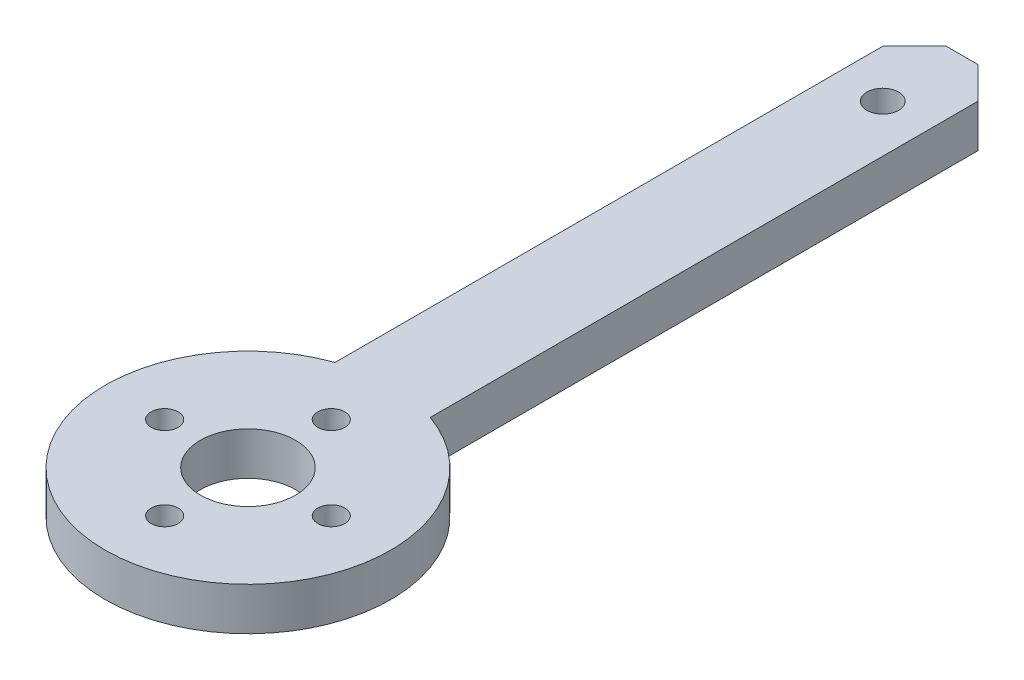
ISO-10303-21;
HEADER;
FILE_DESCRIPTION(('STEP AP214'),'2;1');
FILE_NAME('part.step','',(''),(''),'','','');
FILE_SCHEMA(('AUTOMOTIVE_DESIGN { 1 0 10303 214 1 1 1 1 }'));
ENDSEC;
DATA;
#1=APPLICATION_CONTEXT('core data for automotive mechanical design processes');
#2=APPLICATION_PROTOCOL_DEFINITION('international standard','automotive_design',2000,#1);
#3=PRODUCT_CONTEXT('',#1,'mechanical');
#4=PRODUCT('Part','Part','',(#3));
#5=PRODUCT_RELATED_PRODUCT_CATEGORY('part','',(#4));
#6=PRODUCT_DEFINITION_FORMATION('','',#4);
#7=PRODUCT_DEFINITION_CONTEXT('part definition',#1,'design');
#8=PRODUCT_DEFINITION('design','',#6,#7);
#9=PRODUCT_DEFINITION_SHAPE('','',#8);
#10=(LENGTH_UNIT() NAMED_UNIT(*) SI_UNIT(.MILLI.,.METRE.));
#11=(NAMED_UNIT(*) PLANE_ANGLE_UNIT() SI_UNIT($,.RADIAN.));
#12=(NAMED_UNIT(*) SI_UNIT($,.STERADIAN.) SOLID_ANGLE_UNIT());
#13=UNCERTAINTY_MEASURE_WITH_UNIT(LENGTH_MEASURE(1.E-05),#10,'distance_accuracy_value','');
#14=(GEOMETRIC_REPRESENTATION_CONTEXT(3) GLOBAL_UNCERTAINTY_ASSIGNED_CONTEXT((#13)) GLOBAL_UNIT_ASSIGNED_CONTEXT((#10,
#11,#12)) REPRESENTATION_CONTEXT('',''));
#15=CARTESIAN_POINT('',(0.,0.,0.));
#16=DIRECTION('',(0.,0.,1.));
#17=DIRECTION('',(1.,0.,0.));
#18=AXIS2_PLACEMENT_3D('',#15,#16,#17);
#19=CARTESIAN_POINT('',(0.,5.4,0.));
#20=DIRECTION('',(0.,-1.,0.));
#21=DIRECTION('',(0.,0.,-1.));
#22=AXIS2_PLACEMENT_3D('',#19,#20,#21);
#23=CYLINDRICAL_SURFACE('',#22,18.);
#24=DIRECTION('',(0.,-1.,0.));
#25=VECTOR('',#24,1.);
#26=CARTESIAN_POINT('',(-6.,5.4,-16.9705627484771));
#27=LINE('',#26,#25);
#28=CARTESIAN_POINT('',(-6.,0.,-16.9705627484771));
#29=VERTEX_POINT('',#28);
#30=CARTESIAN_POINT('',(-6.,5.4,-16.9705627484771));
#31=VERTEX_POINT('',#30);
#32=EDGE_CURVE('E101',#29,#31,#27,.F.);
#33=ORIENTED_EDGE('',*,*,#32,.F.);
#34=CARTESIAN_POINT('',(0.,0.,0.));
#35=DIRECTION('',(0.,1.,0.));
#36=DIRECTION('',(0.,0.,1.));
#37=AXIS2_PLACEMENT_3D('',#34,#35,#36);
#38=CIRCLE('',#37,18.);
#39=CARTESIAN_POINT('',(6.,0.,-16.9705627484771));
#40=VERTEX_POINT('',#39);
#41=EDGE_CURVE('E97',#29,#40,#38,.T.);
#42=ORIENTED_EDGE('',*,*,#41,.T.);
#43=DIRECTION('',(0.,-1.,0.));
#44=VECTOR('',#43,1.);
#45=CARTESIAN_POINT('',(6.,5.4,-16.9705627484771));
#46=LINE('',#45,#44);
#47=CARTESIAN_POINT('',(6.,5.4,-16.9705627484771));
#48=VERTEX_POINT('',#47);
#49=EDGE_CURVE('E99',#48,#40,#46,.T.);
#50=ORIENTED_EDGE('',*,*,#49,.F.);
#51=CARTESIAN_POINT('',(0.,5.4,0.));
#52=DIRECTION('',(0.,1.,0.));
#53=DIRECTION('',(0.,0.,1.));
#54=AXIS2_PLACEMENT_3D('',#51,#52,#53);
#55=CIRCLE('',#54,18.);
#56=EDGE_CURVE('E110',#31,#48,#55,.T.);
#57=ORIENTED_EDGE('',*,*,#56,.F.);
#58=EDGE_LOOP('',(#33,#42,#50,#57));
#59=FACE_BOUND('',#58,.T.);
#60=ADVANCED_FACE('F41',(#59),#23,.T.);
#61=CARTESIAN_POINT('',(0.,5.4,0.));
#62=DIRECTION('',(0.,1.,0.));
#63=DIRECTION('',(0.,0.,1.));
#64=AXIS2_PLACEMENT_3D('',#61,#62,#63);
#65=PLANE('',#64);
#66=CARTESIAN_POINT('',(0.,5.4,-80.));
#67=DIRECTION('',(0.,1.,0.));
#68=DIRECTION('',(0.,0.,1.));
#69=AXIS2_PLACEMENT_3D('',#66,#67,#68);
#70=CIRCLE('',#69,2.);
#71=CARTESIAN_POINT('',(0.,5.4,-78.));
#72=VERTEX_POINT('',#71);
#73=EDGE_CURVE('E184',#72,#72,#70,.T.);
#74=ORIENTED_EDGE('',*,*,#73,.F.);
#75=EDGE_LOOP('',(#74));
#76=FACE_BOUND('',#75,.T.);
#77=CARTESIAN_POINT('',(10.5,5.4,0.));
#78=DIRECTION('',(0.,1.,0.));
#79=DIRECTION('',(0.,0.,1.));
#80=AXIS2_PLACEMENT_3D('',#77,#78,#79);
#81=CIRCLE('',#80,1.7);
#82=CARTESIAN_POINT('',(10.5,5.4,-1.7));
#83=VERTEX_POINT('',#82);
#84=EDGE_CURVE('E125',#83,#83,#81,.T.);
#85=ORIENTED_EDGE('',*,*,#84,.F.);
#86=EDGE_LOOP('',(#85));
#87=FACE_BOUND('',#86,.T.);
#88=CARTESIAN_POINT('',(1.09981662173559E-13,5.4,-10.5));
#89=DIRECTION('',(0.,1.,0.));
#90=DIRECTION('',(0.,0.,1.));
#91=AXIS2_PLACEMENT_3D('',#88,#89,#90);
#92=CIRCLE('',#91,1.7);
#93=CARTESIAN_POINT('',(1.09981662173559E-13,5.4,-12.2));
#94=VERTEX_POINT('',#93);
#95=EDGE_CURVE('E169',#94,#94,#92,.T.);
#96=ORIENTED_EDGE('',*,*,#95,.F.);
#97=EDGE_LOOP('',(#96));
#98=FACE_BOUND('',#97,.T.);
#99=CARTESIAN_POINT('',(-10.5,5.4,0.));
#100=DIRECTION('',(0.,1.,0.));
#101=DIRECTION('',(0.,0.,1.));
#102=AXIS2_PLACEMENT_3D('',#99,#100,#101);
#103=CIRCLE('',#102,1.7);
#104=CARTESIAN_POINT('',(-10.5,5.4,-1.70000000000007));
#105=VERTEX_POINT('',#104);
#106=EDGE_CURVE('E176',#105,#105,#103,.T.);
#107=ORIENTED_EDGE('',*,*,#106,.F.);
#108=EDGE_LOOP('',(#107));
#109=FACE_BOUND('',#108,.T.);
#110=CARTESIAN_POINT('',(0.,5.4,10.5));
#111=DIRECTION('',(0.,1.,0.));
#112=DIRECTION('',(0.,0.,1.));
#113=AXIS2_PLACEMENT_3D('',#110,#111,#112);
#114=CIRCLE('',#113,1.7);
#115=CARTESIAN_POINT('',(0.,5.4,8.8));
#116=VERTEX_POINT('',#115);
#117=EDGE_CURVE('E154',#116,#116,#114,.T.);
#118=ORIENTED_EDGE('',*,*,#117,.F.);
#119=EDGE_LOOP('',(#118));
#120=FACE_BOUND('',#119,.T.);
#121=CARTESIAN_POINT('',(0.,5.4,0.));
#122=DIRECTION('',(0.,1.,0.));
#123=DIRECTION('',(0.,0.,1.));
#124=AXIS2_PLACEMENT_3D('',#121,#122,#123);
#125=CIRCLE('',#124,6.);
#126=CARTESIAN_POINT('',(0.,5.4,-6.));
#127=VERTEX_POINT('',#126);
#128=EDGE_CURVE('E162',#127,#127,#125,.T.);
#129=ORIENTED_EDGE('',*,*,#128,.F.);
#130=EDGE_LOOP('',(#129));
#131=FACE_BOUND('',#130,.T.);
#132=DIRECTION('',(-1.,0.,0.));
#133=VECTOR('',#132,1.);
#134=CARTESIAN_POINT('',(-6.,5.4,-90.));
#135=LINE('',#134,#133);
#136=CARTESIAN_POINT('',(2.,5.4,-90.));
#137=VERTEX_POINT('',#136);
#138=CARTESIAN_POINT('',(-1.99999999999998,5.4,-90.));
#139=VERTEX_POINT('',#138);
#140=EDGE_CURVE('E115',#137,#139,#135,.T.);
#141=ORIENTED_EDGE('',*,*,#140,.T.);
#142=DIRECTION('',(0.707106781186549,0.,-0.707106781186546));
#143=VECTOR('',#142,1.);
#144=CARTESIAN_POINT('',(-46.,5.4,-46.0000000000001));
#145=LINE('',#144,#143);
#146=CARTESIAN_POINT('',(-6.,5.4,-86.));
#147=VERTEX_POINT('',#146);
#148=EDGE_CURVE('E49',#139,#147,#145,.F.);
#149=ORIENTED_EDGE('',*,*,#148,.T.);
#150=DIRECTION('',(0.,0.,1.));
#151=VECTOR('',#150,1.);
#152=CARTESIAN_POINT('',(-5.99999999999999,5.4,0.));
#153=LINE('',#152,#151);
#154=EDGE_CURVE('E119',#147,#31,#153,.T.);
#155=ORIENTED_EDGE('',*,*,#154,.T.);
#156=ORIENTED_EDGE('',*,*,#56,.T.);
#157=DIRECTION('',(0.,0.,-1.));
#158=VECTOR('',#157,1.);
#159=CARTESIAN_POINT('',(6.,5.4,0.));
#160=LINE('',#159,#158);
#161=CARTESIAN_POINT('',(6.,5.4,-86.));
#162=VERTEX_POINT('',#161);
#163=EDGE_CURVE('E111',#48,#162,#160,.T.);
#164=ORIENTED_EDGE('',*,*,#163,.T.);
#165=DIRECTION('',(0.707106781186546,0.,0.707106781186549));
#166=VECTOR('',#165,1.);
#167=CARTESIAN_POINT('',(46.,5.4,-45.9999999999998));
#168=LINE('',#167,#166);
#169=EDGE_CURVE('E139',#162,#137,#168,.F.);
#170=ORIENTED_EDGE('',*,*,#169,.T.);
#171=EDGE_LOOP('',(#141,#149,#155,#156,#164,#170));
#172=FACE_BOUND('',#171,.T.);
#173=ADVANCED_FACE('F145',(#76,#87,#98,#109,#120,#131,#172),#65,.T.);
#174=CARTESIAN_POINT('',(0.,0.,0.));
#175=DIRECTION('',(0.,1.,0.));
#176=DIRECTION('',(0.,0.,1.));
#177=AXIS2_PLACEMENT_3D('',#174,#175,#176);
#178=PLANE('',#177);
#179=CARTESIAN_POINT('',(0.,0.,-80.));
#180=DIRECTION('',(0.,1.,0.));
#181=DIRECTION('',(0.,0.,1.));
#182=AXIS2_PLACEMENT_3D('',#179,#180,#181);
#183=CIRCLE('',#182,2.);
#184=CARTESIAN_POINT('',(0.,0.,-78.));
#185=VERTEX_POINT('',#184);
#186=EDGE_CURVE('E173',#185,#185,#183,.T.);
#187=ORIENTED_EDGE('',*,*,#186,.T.);
#188=EDGE_LOOP('',(#187));
#189=FACE_BOUND('',#188,.T.);
#190=CARTESIAN_POINT('',(10.5,0.,0.));
#191=DIRECTION('',(0.,1.,0.));
#192=DIRECTION('',(0.,0.,1.));
#193=AXIS2_PLACEMENT_3D('',#190,#191,#192);
#194=CIRCLE('',#193,1.7);
#195=CARTESIAN_POINT('',(10.5,0.,-1.7));
#196=VERTEX_POINT('',#195);
#197=EDGE_CURVE('E166',#196,#196,#194,.T.);
#198=ORIENTED_EDGE('',*,*,#197,.T.);
#199=EDGE_LOOP('',(#198));
#200=FACE_BOUND('',#199,.T.);
#201=CARTESIAN_POINT('',(1.09981662173559E-13,0.,-10.5));
#202=DIRECTION('',(0.,1.,0.));
#203=DIRECTION('',(0.,0.,1.));
#204=AXIS2_PLACEMENT_3D('',#201,#202,#203);
#205=CIRCLE('',#204,1.7);
#206=CARTESIAN_POINT('',(1.09981662173559E-13,0.,-12.2));
#207=VERTEX_POINT('',#206);
#208=EDGE_CURVE('E175',#207,#207,#205,.T.);
#209=ORIENTED_EDGE('',*,*,#208,.T.);
#210=EDGE_LOOP('',(#209));
#211=FACE_BOUND('',#210,.T.);
#212=CARTESIAN_POINT('',(-10.5,0.,0.));
#213=DIRECTION('',(0.,1.,0.));
#214=DIRECTION('',(0.,0.,1.));
#215=AXIS2_PLACEMENT_3D('',#212,#213,#214);
#216=CIRCLE('',#215,1.7);
#217=CARTESIAN_POINT('',(-10.5,0.,-1.70000000000007));
#218=VERTEX_POINT('',#217);
#219=EDGE_CURVE('E158',#218,#218,#216,.T.);
#220=ORIENTED_EDGE('',*,*,#219,.T.);
#221=EDGE_LOOP('',(#220));
#222=FACE_BOUND('',#221,.T.);
#223=CARTESIAN_POINT('',(0.,0.,10.5));
#224=DIRECTION('',(0.,1.,0.));
#225=DIRECTION('',(0.,0.,1.));
#226=AXIS2_PLACEMENT_3D('',#223,#224,#225);
#227=CIRCLE('',#226,1.7);
#228=CARTESIAN_POINT('',(0.,0.,8.8));
#229=VERTEX_POINT('',#228);
#230=EDGE_CURVE('E159',#229,#229,#227,.T.);
#231=ORIENTED_EDGE('',*,*,#230,.T.);
#232=EDGE_LOOP('',(#231));
#233=FACE_BOUND('',#232,.T.);
#234=CARTESIAN_POINT('',(0.,0.,0.));
#235=DIRECTION('',(0.,1.,0.));
#236=DIRECTION('',(0.,0.,1.));
#237=AXIS2_PLACEMENT_3D('',#234,#235,#236);
#238=CIRCLE('',#237,6.);
#239=CARTESIAN_POINT('',(0.,0.,-6.));
#240=VERTEX_POINT('',#239);
#241=EDGE_CURVE('E164',#240,#240,#238,.T.);
#242=ORIENTED_EDGE('',*,*,#241,.T.);
#243=EDGE_LOOP('',(#242));
#244=FACE_BOUND('',#243,.T.);
#245=DIRECTION('',(0.,0.,1.));
#246=VECTOR('',#245,1.);
#247=CARTESIAN_POINT('',(-5.99999999999999,0.,0.));
#248=LINE('',#247,#246);
#249=CARTESIAN_POINT('',(-6.,0.,-86.));
#250=VERTEX_POINT('',#249);
#251=EDGE_CURVE('E117',#250,#29,#248,.T.);
#252=ORIENTED_EDGE('',*,*,#251,.F.);
#253=DIRECTION('',(-0.707106781186549,0.,0.707106781186546));
#254=VECTOR('',#253,1.);
#255=CARTESIAN_POINT('',(-6.,0.,-86.));
#256=LINE('',#255,#254);
#257=CARTESIAN_POINT('',(-1.99999999999998,0.,-90.));
#258=VERTEX_POINT('',#257);
#259=EDGE_CURVE('E135',#250,#258,#256,.F.);
#260=ORIENTED_EDGE('',*,*,#259,.T.);
#261=DIRECTION('',(-1.,0.,0.));
#262=VECTOR('',#261,1.);
#263=CARTESIAN_POINT('',(-6.,0.,-90.));
#264=LINE('',#263,#262);
#265=CARTESIAN_POINT('',(2.,0.,-90.));
#266=VERTEX_POINT('',#265);
#267=EDGE_CURVE('E120',#266,#258,#264,.T.);
#268=ORIENTED_EDGE('',*,*,#267,.F.);
#269=DIRECTION('',(-0.707106781186546,0.,-0.707106781186549));
#270=VECTOR('',#269,1.);
#271=CARTESIAN_POINT('',(2.,0.,-90.));
#272=LINE('',#271,#270);
#273=CARTESIAN_POINT('',(6.,0.,-86.));
#274=VERTEX_POINT('',#273);
#275=EDGE_CURVE('E116',#266,#274,#272,.F.);
#276=ORIENTED_EDGE('',*,*,#275,.T.);
#277=DIRECTION('',(0.,0.,-1.));
#278=VECTOR('',#277,1.);
#279=CARTESIAN_POINT('',(6.,0.,0.));
#280=LINE('',#279,#278);
#281=EDGE_CURVE('E109',#40,#274,#280,.T.);
#282=ORIENTED_EDGE('',*,*,#281,.F.);
#283=ORIENTED_EDGE('',*,*,#41,.F.);
#284=EDGE_LOOP('',(#252,#260,#268,#276,#282,#283));
#285=FACE_BOUND('',#284,.T.);
#286=ADVANCED_FACE('F112',(#189,#200,#211,#222,#233,#244,#285),#178,.F.);
#287=CARTESIAN_POINT('',(-5.99999999999999,5.4,0.));
#288=DIRECTION('',(1.,0.,0.));
#289=DIRECTION('',(0.,0.,-1.));
#290=AXIS2_PLACEMENT_3D('',#287,#288,#289);
#291=PLANE('',#290);
#292=ORIENTED_EDGE('',*,*,#154,.F.);
#293=DIRECTION('',(0.,-1.,0.));
#294=VECTOR('',#293,1.);
#295=CARTESIAN_POINT('',(-6.,5.4,-86.));
#296=LINE('',#295,#294);
#297=EDGE_CURVE('E130',#147,#250,#296,.T.);
#298=ORIENTED_EDGE('',*,*,#297,.T.);
#299=ORIENTED_EDGE('',*,*,#251,.T.);
#300=ORIENTED_EDGE('',*,*,#32,.T.);
#301=EDGE_LOOP('',(#292,#298,#299,#300));
#302=FACE_BOUND('',#301,.T.);
#303=ADVANCED_FACE('F147',(#302),#291,.F.);
#304=CARTESIAN_POINT('',(6.,5.4,0.));
#305=DIRECTION('',(-1.,0.,0.));
#306=DIRECTION('',(0.,0.,1.));
#307=AXIS2_PLACEMENT_3D('',#304,#305,#306);
#308=PLANE('',#307);
#309=ORIENTED_EDGE('',*,*,#281,.T.);
#310=DIRECTION('',(0.,1.,0.));
#311=VECTOR('',#310,1.);
#312=CARTESIAN_POINT('',(6.,5.4,-86.));
#313=LINE('',#312,#311);
#314=EDGE_CURVE('E11',#274,#162,#313,.T.);
#315=ORIENTED_EDGE('',*,*,#314,.T.);
#316=ORIENTED_EDGE('',*,*,#163,.F.);
#317=ORIENTED_EDGE('',*,*,#49,.T.);
#318=EDGE_LOOP('',(#309,#315,#316,#317));
#319=FACE_BOUND('',#318,.T.);
#320=ADVANCED_FACE('F107',(#319),#308,.F.);
#321=CARTESIAN_POINT('',(-6.,5.4,-90.));
#322=DIRECTION('',(0.,0.,1.));
#323=DIRECTION('',(1.,0.,0.));
#324=AXIS2_PLACEMENT_3D('',#321,#322,#323);
#325=PLANE('',#324);
#326=ORIENTED_EDGE('',*,*,#267,.T.);
#327=DIRECTION('',(0.,1.,0.));
#328=VECTOR('',#327,1.);
#329=CARTESIAN_POINT('',(-1.99999999999998,5.4,-90.));
#330=LINE('',#329,#328);
#331=EDGE_CURVE('E64',#258,#139,#330,.T.);
#332=ORIENTED_EDGE('',*,*,#331,.T.);
#333=ORIENTED_EDGE('',*,*,#140,.F.);
#334=DIRECTION('',(0.,-1.,0.));
#335=VECTOR('',#334,1.);
#336=CARTESIAN_POINT('',(2.,5.4,-90.));
#337=LINE('',#336,#335);
#338=EDGE_CURVE('E133',#137,#266,#337,.T.);
#339=ORIENTED_EDGE('',*,*,#338,.T.);
#340=EDGE_LOOP('',(#326,#332,#333,#339));
#341=FACE_BOUND('',#340,.T.);
#342=ADVANCED_FACE('F146',(#341),#325,.F.);
#343=CARTESIAN_POINT('',(0.,5.4,0.));
#344=DIRECTION('',(0.,-1.,0.));
#345=DIRECTION('',(0.,0.,-1.));
#346=AXIS2_PLACEMENT_3D('',#343,#344,#345);
#347=CYLINDRICAL_SURFACE('',#346,6.);
#348=CARTESIAN_POINT('',(0.,5.4,-6.));
#349=CARTESIAN_POINT('',(0.,5.34375,-6.));
#350=CARTESIAN_POINT('',(0.,5.2875,-6.));
#351=CARTESIAN_POINT('',(0.,5.175,-6.));
#352=CARTESIAN_POINT('',(0.,5.11875,-6.));
#353=CARTESIAN_POINT('',(0.,5.00625,-6.));
#354=CARTESIAN_POINT('',(0.,4.95,-6.));
#355=CARTESIAN_POINT('',(0.,4.8375,-6.));
#356=CARTESIAN_POINT('',(0.,4.78125,-6.));
#357=CARTESIAN_POINT('',(0.,4.66875,-6.));
#358=CARTESIAN_POINT('',(0.,4.6125,-6.));
#359=CARTESIAN_POINT('',(0.,4.5,-6.));
#360=CARTESIAN_POINT('',(0.,4.44375,-6.));
#361=CARTESIAN_POINT('',(0.,4.33125,-6.));
#362=CARTESIAN_POINT('',(0.,4.275,-6.));
#363=CARTESIAN_POINT('',(0.,4.1625,-6.));
#364=CARTESIAN_POINT('',(0.,4.10625,-6.));
#365=CARTESIAN_POINT('',(0.,3.99375,-6.));
#366=CARTESIAN_POINT('',(0.,3.9375,-6.));
#367=CARTESIAN_POINT('',(0.,3.825,-6.));
#368=CARTESIAN_POINT('',(0.,3.76875,-6.));
#369=CARTESIAN_POINT('',(0.,3.65625,-6.));
#370=CARTESIAN_POINT('',(0.,3.6,-6.));
#371=CARTESIAN_POINT('',(0.,3.4875,-6.));
#372=CARTESIAN_POINT('',(0.,3.43125,-6.));
#373=CARTESIAN_POINT('',(0.,3.31875,-6.));
#374=CARTESIAN_POINT('',(0.,3.2625,-6.));
#375=CARTESIAN_POINT('',(0.,3.15,-6.));
#376=CARTESIAN_POINT('',(0.,3.09375,-6.));
#377=CARTESIAN_POINT('',(0.,2.98125,-6.));
#378=CARTESIAN_POINT('',(0.,2.925,-6.));
#379=CARTESIAN_POINT('',(0.,2.8125,-6.));
#380=CARTESIAN_POINT('',(0.,2.75625,-6.));
#381=CARTESIAN_POINT('',(0.,2.64375,-6.));
#382=CARTESIAN_POINT('',(0.,2.5875,-6.));
#383=CARTESIAN_POINT('',(0.,2.475,-6.));
#384=CARTESIAN_POINT('',(0.,2.41875,-6.));
#385=CARTESIAN_POINT('',(0.,2.30625,-6.));
#386=CARTESIAN_POINT('',(0.,2.25,-6.));
#387=CARTESIAN_POINT('',(0.,2.1375,-6.));
#388=CARTESIAN_POINT('',(0.,2.08125,-6.));
#389=CARTESIAN_POINT('',(0.,1.96875,-6.));
#390=CARTESIAN_POINT('',(0.,1.9125,-6.));
#391=CARTESIAN_POINT('',(0.,1.8,-6.));
#392=CARTESIAN_POINT('',(0.,1.74375,-6.));
#393=CARTESIAN_POINT('',(0.,1.63125,-6.));
#394=CARTESIAN_POINT('',(0.,1.575,-6.));
#395=CARTESIAN_POINT('',(0.,1.4625,-6.));
#396=CARTESIAN_POINT('',(0.,1.40625,-6.));
#397=CARTESIAN_POINT('',(0.,1.29375,-6.));
#398=CARTESIAN_POINT('',(0.,1.2375,-6.));
#399=CARTESIAN_POINT('',(0.,1.125,-6.));
#400=CARTESIAN_POINT('',(0.,1.06875,-6.));
#401=CARTESIAN_POINT('',(0.,0.956249999999999,-6.));
#402=CARTESIAN_POINT('',(0.,0.899999999999999,-6.));
#403=CARTESIAN_POINT('',(0.,0.787499999999999,-6.));
#404=CARTESIAN_POINT('',(0.,0.731249999999999,-6.));
#405=CARTESIAN_POINT('',(0.,0.618749999999999,-6.));
#406=CARTESIAN_POINT('',(0.,0.562499999999999,-6.));
#407=CARTESIAN_POINT('',(0.,0.449999999999999,-6.));
#408=CARTESIAN_POINT('',(0.,0.393749999999999,-6.));
#409=CARTESIAN_POINT('',(0.,0.281249999999999,-6.));
#410=CARTESIAN_POINT('',(0.,0.224999999999999,-6.));
#411=CARTESIAN_POINT('',(0.,0.112499999999999,-6.));
#412=CARTESIAN_POINT('',(0.,0.0562499999999989,-6.));
#413=CARTESIAN_POINT('',(0.,0.,-6.));
#414=B_SPLINE_CURVE_WITH_KNOTS('',3,(#348,#349,#350,#351,#352,#353,#354,#355,#356,#357,#358,
#359,#360,#361,#362,#363,#364,#365,#366,#367,#368,#369,#370,#371,#372,#373,#374,#375,#376,#377,
#378,#379,#380,#381,#382,#383,#384,#385,#386,#387,#388,#389,#390,#391,#392,#393,#394,#395,#396,
#397,#398,#399,#400,#401,#402,#403,#404,#405,#406,#407,#408,#409,#410,#411,#412,#413),
.UNSPECIFIED.,.F.,.F.,(4,2,2,2,2,2,2,2,2,2,2,2,2,2,2,2,2,2,2,2,2,2,2,2,2,2,2,2,2,2,2,2,4),(0.,
0.16875,0.337499999999999,0.50625,0.674999999999999,0.84375,1.0125,1.18125,1.35,1.51875,1.6875,
1.85625,2.025,2.19375,2.3625,2.53125,2.7,2.86875,3.0375,3.20625,3.375,3.54375,3.7125,3.88125,
4.05,4.21875,4.3875,4.55625,4.725,4.89375,5.0625,5.23125,5.4),.UNSPECIFIED.);
#415=EDGE_CURVE('BSEAM215',#127,#240,#414,.T.);
#416=ORIENTED_EDGE('',*,*,#128,.T.);
#417=ORIENTED_EDGE('',*,*,#241,.F.);
#418=ORIENTED_EDGE('',*,*,#415,.T.);
#419=ORIENTED_EDGE('',*,*,#415,.F.);
#420=EDGE_LOOP('',(#416,#418,#417,#419));
#421=FACE_BOUND('',#420,.T.);
#422=ADVANCED_FACE('F215',(#421),#347,.F.);
#423=CARTESIAN_POINT('',(0.,5.4,10.5));
#424=DIRECTION('',(0.,-1.,0.));
#425=DIRECTION('',(0.,0.,-1.));
#426=AXIS2_PLACEMENT_3D('',#423,#424,#425);
#427=CYLINDRICAL_SURFACE('',#426,1.7);
#428=CARTESIAN_POINT('',(0.,5.4,8.8));
#429=CARTESIAN_POINT('',(0.,5.34375,8.8));
#430=CARTESIAN_POINT('',(0.,5.2875,8.8));
#431=CARTESIAN_POINT('',(0.,5.175,8.8));
#432=CARTESIAN_POINT('',(0.,5.11875,8.8));
#433=CARTESIAN_POINT('',(0.,5.00625,8.8));
#434=CARTESIAN_POINT('',(0.,4.95,8.8));
#435=CARTESIAN_POINT('',(0.,4.8375,8.8));
#436=CARTESIAN_POINT('',(0.,4.78125,8.8));
#437=CARTESIAN_POINT('',(0.,4.66875,8.8));
#438=CARTESIAN_POINT('',(0.,4.6125,8.8));
#439=CARTESIAN_POINT('',(0.,4.5,8.8));
#440=CARTESIAN_POINT('',(0.,4.44375,8.8));
#441=CARTESIAN_POINT('',(0.,4.33125,8.8));
#442=CARTESIAN_POINT('',(0.,4.275,8.8));
#443=CARTESIAN_POINT('',(0.,4.1625,8.8));
#444=CARTESIAN_POINT('',(0.,4.10625,8.8));
#445=CARTESIAN_POINT('',(0.,3.99375,8.8));
#446=CARTESIAN_POINT('',(0.,3.9375,8.8));
#447=CARTESIAN_POINT('',(0.,3.825,8.8));
#448=CARTESIAN_POINT('',(0.,3.76875,8.8));
#449=CARTESIAN_POINT('',(0.,3.65625,8.8));
#450=CARTESIAN_POINT('',(0.,3.6,8.8));
#451=CARTESIAN_POINT('',(0.,3.4875,8.8));
#452=CARTESIAN_POINT('',(0.,3.43125,8.8));
#453=CARTESIAN_POINT('',(0.,3.31875,8.8));
#454=CARTESIAN_POINT('',(0.,3.2625,8.8));
#455=CARTESIAN_POINT('',(0.,3.15,8.8));
#456=CARTESIAN_POINT('',(0.,3.09375,8.8));
#457=CARTESIAN_POINT('',(0.,2.98125,8.8));
#458=CARTESIAN_POINT('',(0.,2.925,8.8));
#459=CARTESIAN_POINT('',(0.,2.8125,8.8));
#460=CARTESIAN_POINT('',(0.,2.75625,8.8));
#461=CARTESIAN_POINT('',(0.,2.64375,8.8));
#462=CARTESIAN_POINT('',(0.,2.5875,8.8));
#463=CARTESIAN_POINT('',(0.,2.475,8.8));
#464=CARTESIAN_POINT('',(0.,2.41875,8.8));
#465=CARTESIAN_POINT('',(0.,2.30625,8.8));
#466=CARTESIAN_POINT('',(0.,2.25,8.8));
#467=CARTESIAN_POINT('',(0.,2.1375,8.8));
#468=CARTESIAN_POINT('',(0.,2.08125,8.8));
#469=CARTESIAN_POINT('',(0.,1.96875,8.8));
#470=CARTESIAN_POINT('',(0.,1.9125,8.8));
#471=CARTESIAN_POINT('',(0.,1.8,8.8));
#472=CARTESIAN_POINT('',(0.,1.74375,8.8));
#473=CARTESIAN_POINT('',(0.,1.63125,8.8));
#474=CARTESIAN_POINT('',(0.,1.575,8.8));
#475=CARTESIAN_POINT('',(0.,1.4625,8.8));
#476=CARTESIAN_POINT('',(0.,1.40625,8.8));
#477=CARTESIAN_POINT('',(0.,1.29375,8.8));
#478=CARTESIAN_POINT('',(0.,1.2375,8.8));
#479=CARTESIAN_POINT('',(0.,1.125,8.8));
#480=CARTESIAN_POINT('',(0.,1.06875,8.8));
#481=CARTESIAN_POINT('',(0.,0.95625,8.8));
#482=CARTESIAN_POINT('',(0.,0.9,8.8));
#483=CARTESIAN_POINT('',(0.,0.7875,8.8));
#484=CARTESIAN_POINT('',(0.,0.73125,8.8));
#485=CARTESIAN_POINT('',(0.,0.618749999999999,8.8));
#486=CARTESIAN_POINT('',(0.,0.562499999999999,8.8));
#487=CARTESIAN_POINT('',(0.,0.449999999999999,8.8));
#488=CARTESIAN_POINT('',(0.,0.393749999999999,8.8));
#489=CARTESIAN_POINT('',(0.,0.281249999999999,8.8));
#490=CARTESIAN_POINT('',(0.,0.225,8.8));
#491=CARTESIAN_POINT('',(0.,0.112499999999999,8.8));
#492=CARTESIAN_POINT('',(0.,0.0562499999999992,8.8));
#493=CARTESIAN_POINT('',(0.,0.,8.8));
#494=B_SPLINE_CURVE_WITH_KNOTS('',3,(#428,#429,#430,#431,#432,#433,#434,#435,#436,#437,#438,
#439,#440,#441,#442,#443,#444,#445,#446,#447,#448,#449,#450,#451,#452,#453,#454,#455,#456,#457,
#458,#459,#460,#461,#462,#463,#464,#465,#466,#467,#468,#469,#470,#471,#472,#473,#474,#475,#476,
#477,#478,#479,#480,#481,#482,#483,#484,#485,#486,#487,#488,#489,#490,#491,#492,#493),
.UNSPECIFIED.,.F.,.F.,(4,2,2,2,2,2,2,2,2,2,2,2,2,2,2,2,2,2,2,2,2,2,2,2,2,2,2,2,2,2,2,2,4),(0.,
0.168750000000001,0.3375,0.506250000000001,0.675,0.843750000000001,1.0125,1.18125,1.35,1.51875,
1.6875,1.85625,2.025,2.19375,2.3625,2.53125,2.7,2.86875,3.0375,3.20625,3.375,3.54375,3.7125,
3.88125,4.05,4.21875,4.3875,4.55625,4.725,4.89375,5.0625,5.23125,5.4),.UNSPECIFIED.);
#495=EDGE_CURVE('BSEAM213',#116,#229,#494,.T.);
#496=ORIENTED_EDGE('',*,*,#117,.T.);
#497=ORIENTED_EDGE('',*,*,#230,.F.);
#498=ORIENTED_EDGE('',*,*,#495,.T.);
#499=ORIENTED_EDGE('',*,*,#495,.F.);
#500=EDGE_LOOP('',(#496,#498,#497,#499));
#501=FACE_BOUND('',#500,.T.);
#502=ADVANCED_FACE('F213',(#501),#427,.F.);
#503=CARTESIAN_POINT('',(-10.5,5.4,0.));
#504=DIRECTION('',(0.,-1.,0.));
#505=DIRECTION('',(0.,0.,-1.));
#506=AXIS2_PLACEMENT_3D('',#503,#504,#505);
#507=CYLINDRICAL_SURFACE('',#506,1.7);
#508=CARTESIAN_POINT('',(-10.5,5.4,-1.70000000000007));
#509=CARTESIAN_POINT('',(-10.5,5.34375,-1.70000000000007));
#510=CARTESIAN_POINT('',(-10.5,5.2875,-1.70000000000007));
#511=CARTESIAN_POINT('',(-10.5,5.175,-1.70000000000007));
#512=CARTESIAN_POINT('',(-10.5,5.11875,-1.70000000000007));
#513=CARTESIAN_POINT('',(-10.5,5.00625,-1.70000000000007));
#514=CARTESIAN_POINT('',(-10.5,4.95,-1.70000000000007));
#515=CARTESIAN_POINT('',(-10.5,4.8375,-1.70000000000007));
#516=CARTESIAN_POINT('',(-10.5,4.78125,-1.70000000000007));
#517=CARTESIAN_POINT('',(-10.5,4.66875,-1.70000000000007));
#518=CARTESIAN_POINT('',(-10.5,4.6125,-1.70000000000007));
#519=CARTESIAN_POINT('',(-10.5,4.5,-1.70000000000007));
#520=CARTESIAN_POINT('',(-10.5,4.44375,-1.70000000000007));
#521=CARTESIAN_POINT('',(-10.5,4.33125,-1.70000000000007));
#522=CARTESIAN_POINT('',(-10.5,4.275,-1.70000000000007));
#523=CARTESIAN_POINT('',(-10.5,4.1625,-1.70000000000007));
#524=CARTESIAN_POINT('',(-10.5,4.10625,-1.70000000000007));
#525=CARTESIAN_POINT('',(-10.5,3.99375,-1.70000000000007));
#526=CARTESIAN_POINT('',(-10.5,3.9375,-1.70000000000007));
#527=CARTESIAN_POINT('',(-10.5,3.825,-1.70000000000007));
#528=CARTESIAN_POINT('',(-10.5,3.76875,-1.70000000000007));
#529=CARTESIAN_POINT('',(-10.5,3.65625,-1.70000000000007));
#530=CARTESIAN_POINT('',(-10.5,3.6,-1.70000000000007));
#531=CARTESIAN_POINT('',(-10.5,3.4875,-1.70000000000007));
#532=CARTESIAN_POINT('',(-10.5,3.43125,-1.70000000000007));
#533=CARTESIAN_POINT('',(-10.5,3.31875,-1.70000000000007));
#534=CARTESIAN_POINT('',(-10.5,3.2625,-1.70000000000007));
#535=CARTESIAN_POINT('',(-10.5,3.15,-1.70000000000007));
#536=CARTESIAN_POINT('',(-10.5,3.09375,-1.70000000000007));
#537=CARTESIAN_POINT('',(-10.5,2.98125,-1.70000000000007));
#538=CARTESIAN_POINT('',(-10.5,2.925,-1.70000000000007));
#539=CARTESIAN_POINT('',(-10.5,2.8125,-1.70000000000007));
#540=CARTESIAN_POINT('',(-10.5,2.75625,-1.70000000000007));
#541=CARTESIAN_POINT('',(-10.5,2.64375,-1.70000000000007));
#542=CARTESIAN_POINT('',(-10.5,2.5875,-1.70000000000007));
#543=CARTESIAN_POINT('',(-10.5,2.475,-1.70000000000007));
#544=CARTESIAN_POINT('',(-10.5,2.41875,-1.70000000000007));
#545=CARTESIAN_POINT('',(-10.5,2.30625,-1.70000000000007));
#546=CARTESIAN_POINT('',(-10.5,2.25,-1.70000000000007));
#547=CARTESIAN_POINT('',(-10.5,2.1375,-1.70000000000007));
#548=CARTESIAN_POINT('',(-10.5,2.08125,-1.70000000000007));
#549=CARTESIAN_POINT('',(-10.5,1.96875,-1.70000000000007));
#550=CARTESIAN_POINT('',(-10.5,1.9125,-1.70000000000007));
#551=CARTESIAN_POINT('',(-10.5,1.8,-1.70000000000007));
#552=CARTESIAN_POINT('',(-10.5,1.74375,-1.70000000000007));
#553=CARTESIAN_POINT('',(-10.5,1.63125,-1.70000000000007));
#554=CARTESIAN_POINT('',(-10.5,1.575,-1.70000000000007));
#555=CARTESIAN_POINT('',(-10.5,1.4625,-1.70000000000007));
#556=CARTESIAN_POINT('',(-10.5,1.40625,-1.70000000000007));
#557=CARTESIAN_POINT('',(-10.5,1.29375,-1.70000000000007));
#558=CARTESIAN_POINT('',(-10.5,1.2375,-1.70000000000007));
#559=CARTESIAN_POINT('',(-10.5,1.125,-1.70000000000007));
#560=CARTESIAN_POINT('',(-10.5,1.06875,-1.70000000000007));
#561=CARTESIAN_POINT('',(-10.5,0.95625,-1.70000000000007));
#562=CARTESIAN_POINT('',(-10.5,0.9,-1.70000000000007));
#563=CARTESIAN_POINT('',(-10.5,0.7875,-1.70000000000007));
#564=CARTESIAN_POINT('',(-10.5,0.73125,-1.70000000000007));
#565=CARTESIAN_POINT('',(-10.5,0.618749999999999,-1.70000000000007));
#566=CARTESIAN_POINT('',(-10.5,0.562499999999999,-1.70000000000007));
#567=CARTESIAN_POINT('',(-10.5,0.449999999999999,-1.70000000000007));
#568=CARTESIAN_POINT('',(-10.5,0.393749999999999,-1.70000000000007));
#569=CARTESIAN_POINT('',(-10.5,0.281249999999999,-1.70000000000007));
#570=CARTESIAN_POINT('',(-10.5,0.225,-1.70000000000007));
#571=CARTESIAN_POINT('',(-10.5,0.112499999999999,-1.70000000000007));
#572=CARTESIAN_POINT('',(-10.5,0.0562499999999992,-1.70000000000007));
#573=CARTESIAN_POINT('',(-10.5,0.,-1.70000000000007));
#574=B_SPLINE_CURVE_WITH_KNOTS('',3,(#508,#509,#510,#511,#512,#513,#514,#515,#516,#517,#518,
#519,#520,#521,#522,#523,#524,#525,#526,#527,#528,#529,#530,#531,#532,#533,#534,#535,#536,#537,
#538,#539,#540,#541,#542,#543,#544,#545,#546,#547,#548,#549,#550,#551,#552,#553,#554,#555,#556,
#557,#558,#559,#560,#561,#562,#563,#564,#565,#566,#567,#568,#569,#570,#571,#572,#573),
.UNSPECIFIED.,.F.,.F.,(4,2,2,2,2,2,2,2,2,2,2,2,2,2,2,2,2,2,2,2,2,2,2,2,2,2,2,2,2,2,2,2,4),(0.,
0.168750000000001,0.3375,0.506250000000001,0.675,0.843750000000001,1.0125,1.18125,1.35,1.51875,
1.6875,1.85625,2.025,2.19375,2.3625,2.53125,2.7,2.86875,3.0375,3.20625,3.375,3.54375,3.7125,
3.88125,4.05,4.21875,4.3875,4.55625,4.725,4.89375,5.0625,5.23125,5.4),.UNSPECIFIED.);
#575=EDGE_CURVE('BSEAM244',#105,#218,#574,.T.);
#576=ORIENTED_EDGE('',*,*,#106,.T.);
#577=ORIENTED_EDGE('',*,*,#219,.F.);
#578=ORIENTED_EDGE('',*,*,#575,.T.);
#579=ORIENTED_EDGE('',*,*,#575,.F.);
#580=EDGE_LOOP('',(#576,#578,#577,#579));
#581=FACE_BOUND('',#580,.T.);
#582=ADVANCED_FACE('F244',(#581),#507,.F.);
#583=CARTESIAN_POINT('',(1.09981662173559E-13,5.4,-10.5));
#584=DIRECTION('',(0.,-1.,0.));
#585=DIRECTION('',(0.,0.,-1.));
#586=AXIS2_PLACEMENT_3D('',#583,#584,#585);
#587=CYLINDRICAL_SURFACE('',#586,1.7);
#588=CARTESIAN_POINT('',(1.09981662173559E-13,5.4,-12.2));
#589=CARTESIAN_POINT('',(1.09981662173559E-13,5.34375,-12.2));
#590=CARTESIAN_POINT('',(1.09981662173559E-13,5.2875,-12.2));
#591=CARTESIAN_POINT('',(1.09981662173559E-13,5.175,-12.2));
#592=CARTESIAN_POINT('',(1.09981662173559E-13,5.11875,-12.2));
#593=CARTESIAN_POINT('',(1.09981662173559E-13,5.00625,-12.2));
#594=CARTESIAN_POINT('',(1.09981662173559E-13,4.95,-12.2));
#595=CARTESIAN_POINT('',(1.09981662173559E-13,4.8375,-12.2));
#596=CARTESIAN_POINT('',(1.09981662173559E-13,4.78125,-12.2));
#597=CARTESIAN_POINT('',(1.09981662173559E-13,4.66875,-12.2));
#598=CARTESIAN_POINT('',(1.09981662173559E-13,4.6125,-12.2));
#599=CARTESIAN_POINT('',(1.09981662173559E-13,4.5,-12.2));
#600=CARTESIAN_POINT('',(1.09981662173559E-13,4.44375,-12.2));
#601=CARTESIAN_POINT('',(1.09981662173559E-13,4.33125,-12.2));
#602=CARTESIAN_POINT('',(1.09981662173559E-13,4.275,-12.2));
#603=CARTESIAN_POINT('',(1.09981662173559E-13,4.1625,-12.2));
#604=CARTESIAN_POINT('',(1.09981662173559E-13,4.10625,-12.2));
#605=CARTESIAN_POINT('',(1.09981662173559E-13,3.99375,-12.2));
#606=CARTESIAN_POINT('',(1.09981662173559E-13,3.9375,-12.2));
#607=CARTESIAN_POINT('',(1.09981662173559E-13,3.825,-12.2));
#608=CARTESIAN_POINT('',(1.09981662173559E-13,3.76875,-12.2));
#609=CARTESIAN_POINT('',(1.09981662173559E-13,3.65625,-12.2));
#610=CARTESIAN_POINT('',(1.09981662173559E-13,3.6,-12.2));
#611=CARTESIAN_POINT('',(1.09981662173559E-13,3.4875,-12.2));
#612=CARTESIAN_POINT('',(1.09981662173559E-13,3.43125,-12.2));
#613=CARTESIAN_POINT('',(1.09981662173559E-13,3.31875,-12.2));
#614=CARTESIAN_POINT('',(1.09981662173559E-13,3.2625,-12.2));
#615=CARTESIAN_POINT('',(1.09981662173559E-13,3.15,-12.2));
#616=CARTESIAN_POINT('',(1.09981662173559E-13,3.09375,-12.2));
#617=CARTESIAN_POINT('',(1.09981662173559E-13,2.98125,-12.2));
#618=CARTESIAN_POINT('',(1.09981662173559E-13,2.925,-12.2));
#619=CARTESIAN_POINT('',(1.09981662173559E-13,2.8125,-12.2));
#620=CARTESIAN_POINT('',(1.09981662173559E-13,2.75625,-12.2));
#621=CARTESIAN_POINT('',(1.09981662173559E-13,2.64375,-12.2));
#622=CARTESIAN_POINT('',(1.09981662173559E-13,2.5875,-12.2));
#623=CARTESIAN_POINT('',(1.09981662173559E-13,2.475,-12.2));
#624=CARTESIAN_POINT('',(1.09981662173559E-13,2.41875,-12.2));
#625=CARTESIAN_POINT('',(1.09981662173559E-13,2.30625,-12.2));
#626=CARTESIAN_POINT('',(1.09981662173559E-13,2.25,-12.2));
#627=CARTESIAN_POINT('',(1.09981662173559E-13,2.1375,-12.2));
#628=CARTESIAN_POINT('',(1.09981662173559E-13,2.08125,-12.2));
#629=CARTESIAN_POINT('',(1.09981662173559E-13,1.96875,-12.2));
#630=CARTESIAN_POINT('',(1.09981662173559E-13,1.9125,-12.2));
#631=CARTESIAN_POINT('',(1.09981662173559E-13,1.8,-12.2));
#632=CARTESIAN_POINT('',(1.09981662173559E-13,1.74375,-12.2));
#633=CARTESIAN_POINT('',(1.09981662173559E-13,1.63125,-12.2));
#634=CARTESIAN_POINT('',(1.09981662173559E-13,1.575,-12.2));
#635=CARTESIAN_POINT('',(1.09981662173559E-13,1.4625,-12.2));
#636=CARTESIAN_POINT('',(1.09981662173559E-13,1.40625,-12.2));
#637=CARTESIAN_POINT('',(1.09981662173559E-13,1.29375,-12.2));
#638=CARTESIAN_POINT('',(1.09981662173559E-13,1.2375,-12.2));
#639=CARTESIAN_POINT('',(1.09981662173559E-13,1.125,-12.2));
#640=CARTESIAN_POINT('',(1.09981662173559E-13,1.06875,-12.2));
#641=CARTESIAN_POINT('',(1.09981662173559E-13,0.95625,-12.2));
#642=CARTESIAN_POINT('',(1.09981662173559E-13,0.9,-12.2));
#643=CARTESIAN_POINT('',(1.09981662173559E-13,0.7875,-12.2));
#644=CARTESIAN_POINT('',(1.09981662173559E-13,0.73125,-12.2));
#645=CARTESIAN_POINT('',(1.09981662173559E-13,0.618749999999999,-12.2));
#646=CARTESIAN_POINT('',(1.09981662173559E-13,0.562499999999999,-12.2));
#647=CARTESIAN_POINT('',(1.09981662173559E-13,0.449999999999999,-12.2));
#648=CARTESIAN_POINT('',(1.09981662173559E-13,0.393749999999999,-12.2));
#649=CARTESIAN_POINT('',(1.09981662173559E-13,0.281249999999999,-12.2));
#650=CARTESIAN_POINT('',(1.09981662173559E-13,0.225,-12.2));
#651=CARTESIAN_POINT('',(1.09981662173559E-13,0.112499999999999,-12.2));
#652=CARTESIAN_POINT('',(1.09981662173559E-13,0.0562499999999992,-12.2));
#653=CARTESIAN_POINT('',(1.09981662173559E-13,0.,-12.2));
#654=B_SPLINE_CURVE_WITH_KNOTS('',3,(#588,#589,#590,#591,#592,#593,#594,#595,#596,#597,#598,
#599,#600,#601,#602,#603,#604,#605,#606,#607,#608,#609,#610,#611,#612,#613,#614,#615,#616,#617,
#618,#619,#620,#621,#622,#623,#624,#625,#626,#627,#628,#629,#630,#631,#632,#633,#634,#635,#636,
#637,#638,#639,#640,#641,#642,#643,#644,#645,#646,#647,#648,#649,#650,#651,#652,#653),
.UNSPECIFIED.,.F.,.F.,(4,2,2,2,2,2,2,2,2,2,2,2,2,2,2,2,2,2,2,2,2,2,2,2,2,2,2,2,2,2,2,2,4),(0.,
0.168750000000001,0.3375,0.506250000000001,0.675,0.843750000000001,1.0125,1.18125,1.35,1.51875,
1.6875,1.85625,2.025,2.19375,2.3625,2.53125,2.7,2.86875,3.0375,3.20625,3.375,3.54375,3.7125,
3.88125,4.05,4.21875,4.3875,4.55625,4.725,4.89375,5.0625,5.23125,5.4),.UNSPECIFIED.);
#655=EDGE_CURVE('BSEAM237',#94,#207,#654,.T.);
#656=ORIENTED_EDGE('',*,*,#95,.T.);
#657=ORIENTED_EDGE('',*,*,#208,.F.);
#658=ORIENTED_EDGE('',*,*,#655,.T.);
#659=ORIENTED_EDGE('',*,*,#655,.F.);
#660=EDGE_LOOP('',(#656,#658,#657,#659));
#661=FACE_BOUND('',#660,.T.);
#662=ADVANCED_FACE('F237',(#661),#587,.F.);
#663=CARTESIAN_POINT('',(10.5,5.4,0.));
#664=DIRECTION('',(0.,-1.,0.));
#665=DIRECTION('',(0.,0.,-1.));
#666=AXIS2_PLACEMENT_3D('',#663,#664,#665);
#667=CYLINDRICAL_SURFACE('',#666,1.7);
#668=CARTESIAN_POINT('',(10.5,5.4,-1.7));
#669=CARTESIAN_POINT('',(10.5,5.34375,-1.7));
#670=CARTESIAN_POINT('',(10.5,5.2875,-1.7));
#671=CARTESIAN_POINT('',(10.5,5.175,-1.7));
#672=CARTESIAN_POINT('',(10.5,5.11875,-1.7));
#673=CARTESIAN_POINT('',(10.5,5.00625,-1.7));
#674=CARTESIAN_POINT('',(10.5,4.95,-1.7));
#675=CARTESIAN_POINT('',(10.5,4.8375,-1.7));
#676=CARTESIAN_POINT('',(10.5,4.78125,-1.7));
#677=CARTESIAN_POINT('',(10.5,4.66875,-1.7));
#678=CARTESIAN_POINT('',(10.5,4.6125,-1.7));
#679=CARTESIAN_POINT('',(10.5,4.5,-1.7));
#680=CARTESIAN_POINT('',(10.5,4.44375,-1.7));
#681=CARTESIAN_POINT('',(10.5,4.33125,-1.7));
#682=CARTESIAN_POINT('',(10.5,4.275,-1.7));
#683=CARTESIAN_POINT('',(10.5,4.1625,-1.7));
#684=CARTESIAN_POINT('',(10.5,4.10625,-1.7));
#685=CARTESIAN_POINT('',(10.5,3.99375,-1.7));
#686=CARTESIAN_POINT('',(10.5,3.9375,-1.7));
#687=CARTESIAN_POINT('',(10.5,3.825,-1.7));
#688=CARTESIAN_POINT('',(10.5,3.76875,-1.7));
#689=CARTESIAN_POINT('',(10.5,3.65625,-1.7));
#690=CARTESIAN_POINT('',(10.5,3.6,-1.7));
#691=CARTESIAN_POINT('',(10.5,3.4875,-1.7));
#692=CARTESIAN_POINT('',(10.5,3.43125,-1.7));
#693=CARTESIAN_POINT('',(10.5,3.31875,-1.7));
#694=CARTESIAN_POINT('',(10.5,3.2625,-1.7));
#695=CARTESIAN_POINT('',(10.5,3.15,-1.7));
#696=CARTESIAN_POINT('',(10.5,3.09375,-1.7));
#697=CARTESIAN_POINT('',(10.5,2.98125,-1.7));
#698=CARTESIAN_POINT('',(10.5,2.925,-1.7));
#699=CARTESIAN_POINT('',(10.5,2.8125,-1.7));
#700=CARTESIAN_POINT('',(10.5,2.75625,-1.7));
#701=CARTESIAN_POINT('',(10.5,2.64375,-1.7));
#702=CARTESIAN_POINT('',(10.5,2.5875,-1.7));
#703=CARTESIAN_POINT('',(10.5,2.475,-1.7));
#704=CARTESIAN_POINT('',(10.5,2.41875,-1.7));
#705=CARTESIAN_POINT('',(10.5,2.30625,-1.7));
#706=CARTESIAN_POINT('',(10.5,2.25,-1.7));
#707=CARTESIAN_POINT('',(10.5,2.1375,-1.7));
#708=CARTESIAN_POINT('',(10.5,2.08125,-1.7));
#709=CARTESIAN_POINT('',(10.5,1.96875,-1.7));
#710=CARTESIAN_POINT('',(10.5,1.9125,-1.7));
#711=CARTESIAN_POINT('',(10.5,1.8,-1.7));
#712=CARTESIAN_POINT('',(10.5,1.74375,-1.7));
#713=CARTESIAN_POINT('',(10.5,1.63125,-1.7));
#714=CARTESIAN_POINT('',(10.5,1.575,-1.7));
#715=CARTESIAN_POINT('',(10.5,1.4625,-1.7));
#716=CARTESIAN_POINT('',(10.5,1.40625,-1.7));
#717=CARTESIAN_POINT('',(10.5,1.29375,-1.7));
#718=CARTESIAN_POINT('',(10.5,1.2375,-1.7));
#719=CARTESIAN_POINT('',(10.5,1.125,-1.7));
#720=CARTESIAN_POINT('',(10.5,1.06875,-1.7));
#721=CARTESIAN_POINT('',(10.5,0.95625,-1.7));
#722=CARTESIAN_POINT('',(10.5,0.9,-1.7));
#723=CARTESIAN_POINT('',(10.5,0.7875,-1.7));
#724=CARTESIAN_POINT('',(10.5,0.73125,-1.7));
#725=CARTESIAN_POINT('',(10.5,0.618749999999999,-1.7));
#726=CARTESIAN_POINT('',(10.5,0.562499999999999,-1.7));
#727=CARTESIAN_POINT('',(10.5,0.449999999999999,-1.7));
#728=CARTESIAN_POINT('',(10.5,0.393749999999999,-1.7));
#729=CARTESIAN_POINT('',(10.5,0.281249999999999,-1.7));
#730=CARTESIAN_POINT('',(10.5,0.225,-1.7));
#731=CARTESIAN_POINT('',(10.5,0.112499999999999,-1.7));
#732=CARTESIAN_POINT('',(10.5,0.0562499999999992,-1.7));
#733=CARTESIAN_POINT('',(10.5,0.,-1.7));
#734=B_SPLINE_CURVE_WITH_KNOTS('',3,(#668,#669,#670,#671,#672,#673,#674,#675,#676,#677,#678,
#679,#680,#681,#682,#683,#684,#685,#686,#687,#688,#689,#690,#691,#692,#693,#694,#695,#696,#697,
#698,#699,#700,#701,#702,#703,#704,#705,#706,#707,#708,#709,#710,#711,#712,#713,#714,#715,#716,
#717,#718,#719,#720,#721,#722,#723,#724,#725,#726,#727,#728,#729,#730,#731,#732,#733),
.UNSPECIFIED.,.F.,.F.,(4,2,2,2,2,2,2,2,2,2,2,2,2,2,2,2,2,2,2,2,2,2,2,2,2,2,2,2,2,2,2,2,4),(0.,
0.168750000000001,0.3375,0.506250000000001,0.675,0.843750000000001,1.0125,1.18125,1.35,1.51875,
1.6875,1.85625,2.025,2.19375,2.3625,2.53125,2.7,2.86875,3.0375,3.20625,3.375,3.54375,3.7125,
3.88125,4.05,4.21875,4.3875,4.55625,4.725,4.89375,5.0625,5.23125,5.4),.UNSPECIFIED.);
#735=EDGE_CURVE('BSEAM231',#83,#196,#734,.T.);
#736=ORIENTED_EDGE('',*,*,#84,.T.);
#737=ORIENTED_EDGE('',*,*,#197,.F.);
#738=ORIENTED_EDGE('',*,*,#735,.T.);
#739=ORIENTED_EDGE('',*,*,#735,.F.);
#740=EDGE_LOOP('',(#736,#738,#737,#739));
#741=FACE_BOUND('',#740,.T.);
#742=ADVANCED_FACE('F231',(#741),#667,.F.);
#743=CARTESIAN_POINT('',(-6.,5.4,-86.));
#744=DIRECTION('',(0.707106781186546,0.,0.707106781186549));
#745=DIRECTION('',(0.,-1.,0.));
#746=AXIS2_PLACEMENT_3D('',#743,#744,#745);
#747=PLANE('',#746);
#748=ORIENTED_EDGE('',*,*,#148,.F.);
#749=ORIENTED_EDGE('',*,*,#331,.F.);
#750=ORIENTED_EDGE('',*,*,#259,.F.);
#751=ORIENTED_EDGE('',*,*,#297,.F.);
#752=EDGE_LOOP('',(#748,#749,#750,#751));
#753=FACE_BOUND('',#752,.T.);
#754=ADVANCED_FACE('F149',(#753),#747,.F.);
#755=CARTESIAN_POINT('',(2.,5.4,-90.));
#756=DIRECTION('',(-0.707106781186549,0.,0.707106781186546));
#757=DIRECTION('',(0.,-1.,0.));
#758=AXIS2_PLACEMENT_3D('',#755,#756,#757);
#759=PLANE('',#758);
#760=ORIENTED_EDGE('',*,*,#169,.F.);
#761=ORIENTED_EDGE('',*,*,#314,.F.);
#762=ORIENTED_EDGE('',*,*,#275,.F.);
#763=ORIENTED_EDGE('',*,*,#338,.F.);
#764=EDGE_LOOP('',(#760,#761,#762,#763));
#765=FACE_BOUND('',#764,.T.);
#766=ADVANCED_FACE('F42',(#765),#759,.F.);
#767=CARTESIAN_POINT('',(0.,0.,-80.));
#768=DIRECTION('',(0.,1.,0.));
#769=DIRECTION('',(0.,0.,1.));
#770=AXIS2_PLACEMENT_3D('',#767,#768,#769);
#771=CYLINDRICAL_SURFACE('',#770,2.);
#772=CARTESIAN_POINT('',(0.,0.,-78.));
#773=CARTESIAN_POINT('',(0.,0.05625,-78.));
#774=CARTESIAN_POINT('',(0.,0.1125,-78.));
#775=CARTESIAN_POINT('',(0.,0.225,-78.));
#776=CARTESIAN_POINT('',(0.,0.28125,-78.));
#777=CARTESIAN_POINT('',(0.,0.39375,-78.));
#778=CARTESIAN_POINT('',(0.,0.45,-78.));
#779=CARTESIAN_POINT('',(0.,0.5625,-78.));
#780=CARTESIAN_POINT('',(0.,0.61875,-78.));
#781=CARTESIAN_POINT('',(0.,0.73125,-78.));
#782=CARTESIAN_POINT('',(0.,0.7875,-78.));
#783=CARTESIAN_POINT('',(0.,0.9,-78.));
#784=CARTESIAN_POINT('',(0.,0.95625,-78.));
#785=CARTESIAN_POINT('',(0.,1.06875,-78.));
#786=CARTESIAN_POINT('',(0.,1.125,-78.));
#787=CARTESIAN_POINT('',(0.,1.2375,-78.));
#788=CARTESIAN_POINT('',(0.,1.29375,-78.));
#789=CARTESIAN_POINT('',(0.,1.40625,-78.));
#790=CARTESIAN_POINT('',(0.,1.4625,-78.));
#791=CARTESIAN_POINT('',(0.,1.575,-78.));
#792=CARTESIAN_POINT('',(0.,1.63125,-78.));
#793=CARTESIAN_POINT('',(0.,1.74375,-78.));
#794=CARTESIAN_POINT('',(0.,1.8,-78.));
#795=CARTESIAN_POINT('',(0.,1.9125,-78.));
#796=CARTESIAN_POINT('',(0.,1.96875,-78.));
#797=CARTESIAN_POINT('',(0.,2.08125,-78.));
#798=CARTESIAN_POINT('',(0.,2.1375,-78.));
#799=CARTESIAN_POINT('',(0.,2.25,-78.));
#800=CARTESIAN_POINT('',(0.,2.30625,-78.));
#801=CARTESIAN_POINT('',(0.,2.41875,-78.));
#802=CARTESIAN_POINT('',(0.,2.475,-78.));
#803=CARTESIAN_POINT('',(0.,2.5875,-78.));
#804=CARTESIAN_POINT('',(0.,2.64375,-78.));
#805=CARTESIAN_POINT('',(0.,2.75625,-78.));
#806=CARTESIAN_POINT('',(0.,2.8125,-78.));
#807=CARTESIAN_POINT('',(0.,2.925,-78.));
#808=CARTESIAN_POINT('',(0.,2.98125,-78.));
#809=CARTESIAN_POINT('',(0.,3.09375,-78.));
#810=CARTESIAN_POINT('',(0.,3.15,-78.));
#811=CARTESIAN_POINT('',(0.,3.2625,-78.));
#812=CARTESIAN_POINT('',(0.,3.31875,-78.));
#813=CARTESIAN_POINT('',(0.,3.43125,-78.));
#814=CARTESIAN_POINT('',(0.,3.4875,-78.));
#815=CARTESIAN_POINT('',(0.,3.6,-78.));
#816=CARTESIAN_POINT('',(0.,3.65625,-78.));
#817=CARTESIAN_POINT('',(0.,3.76875,-78.));
#818=CARTESIAN_POINT('',(0.,3.825,-78.));
#819=CARTESIAN_POINT('',(0.,3.9375,-78.));
#820=CARTESIAN_POINT('',(0.,3.99375,-78.));
#821=CARTESIAN_POINT('',(0.,4.10625,-78.));
#822=CARTESIAN_POINT('',(0.,4.1625,-78.));
#823=CARTESIAN_POINT('',(0.,4.275,-78.));
#824=CARTESIAN_POINT('',(0.,4.33125,-78.));
#825=CARTESIAN_POINT('',(0.,4.44375,-78.));
#826=CARTESIAN_POINT('',(0.,4.5,-78.));
#827=CARTESIAN_POINT('',(0.,4.6125,-78.));
#828=CARTESIAN_POINT('',(0.,4.66875,-78.));
#829=CARTESIAN_POINT('',(0.,4.78125,-78.));
#830=CARTESIAN_POINT('',(0.,4.8375,-78.));
#831=CARTESIAN_POINT('',(0.,4.95,-78.));
#832=CARTESIAN_POINT('',(0.,5.00625,-78.));
#833=CARTESIAN_POINT('',(0.,5.11875,-78.));
#834=CARTESIAN_POINT('',(0.,5.175,-78.));
#835=CARTESIAN_POINT('',(0.,5.2875,-78.));
#836=CARTESIAN_POINT('',(0.,5.34375,-78.));
#837=CARTESIAN_POINT('',(0.,5.4,-78.));
#838=B_SPLINE_CURVE_WITH_KNOTS('',3,(#772,#773,#774,#775,#776,#777,#778,#779,#780,#781,#782,
#783,#784,#785,#786,#787,#788,#789,#790,#791,#792,#793,#794,#795,#796,#797,#798,#799,#800,#801,
#802,#803,#804,#805,#806,#807,#808,#809,#810,#811,#812,#813,#814,#815,#816,#817,#818,#819,#820,
#821,#822,#823,#824,#825,#826,#827,#828,#829,#830,#831,#832,#833,#834,#835,#836,#837),
.UNSPECIFIED.,.F.,.F.,(4,2,2,2,2,2,2,2,2,2,2,2,2,2,2,2,2,2,2,2,2,2,2,2,2,2,2,2,2,2,2,2,4),(0.,
0.16875,0.3375,0.50625,0.675,0.84375,1.0125,1.18125,1.35,1.51875,1.6875,1.85625,2.025,2.19375,
2.3625,2.53125,2.7,2.86875,3.0375,3.20625,3.375,3.54375,3.7125,3.88125,4.05,4.21875,4.3875,
4.55625,4.725,4.89375,5.0625,5.23125,5.4),.UNSPECIFIED.);
#839=EDGE_CURVE('BSEAM194',#185,#72,#838,.T.);
#840=ORIENTED_EDGE('',*,*,#186,.F.);
#841=ORIENTED_EDGE('',*,*,#73,.T.);
#842=ORIENTED_EDGE('',*,*,#839,.T.);
#843=ORIENTED_EDGE('',*,*,#839,.F.);
#844=EDGE_LOOP('',(#840,#842,#841,#843));
#845=FACE_BOUND('',#844,.T.);
#846=ADVANCED_FACE('F194',(#845),#771,.F.);
#847=CLOSED_SHELL('',(#60,#173,#286,#303,#320,#342,#422,#502,#582,#662,#742,#754,#766,#846));
#848=MANIFOLD_SOLID_BREP('B2',#847);
#849=ADVANCED_BREP_SHAPE_REPRESENTATION('',(#18,#848),#14);
#850=SHAPE_DEFINITION_REPRESENTATION(#9,#849);
ENDSEC;
END-ISO-10303-21;
